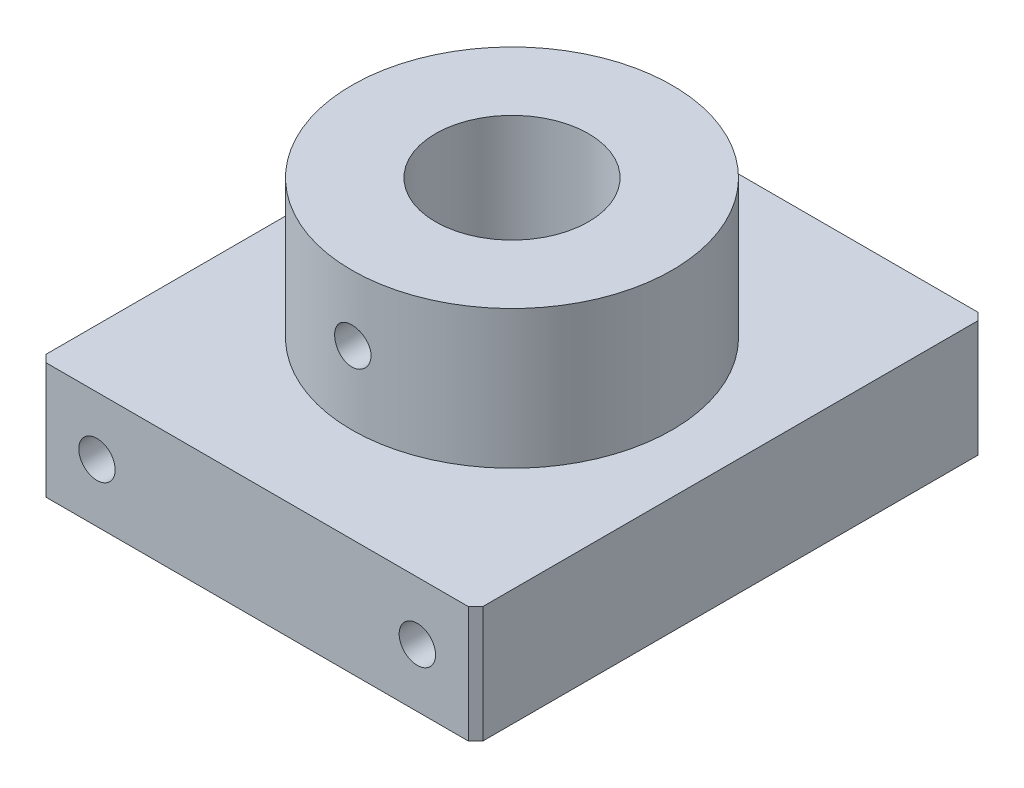
ISO-10303-21;
HEADER;
FILE_DESCRIPTION(('STEP AP214'),'2;1');
FILE_NAME('part.step','',(''),(''),'','','');
FILE_SCHEMA(('AUTOMOTIVE_DESIGN { 1 0 10303 214 1 1 1 1 }'));
ENDSEC;
DATA;
#1=APPLICATION_CONTEXT('core data for automotive mechanical design processes');
#2=APPLICATION_PROTOCOL_DEFINITION('international standard','automotive_design',2000,#1);
#3=PRODUCT_CONTEXT('',#1,'mechanical');
#4=PRODUCT('Part','Part','',(#3));
#5=PRODUCT_RELATED_PRODUCT_CATEGORY('part','',(#4));
#6=PRODUCT_DEFINITION_FORMATION('','',#4);
#7=PRODUCT_DEFINITION_CONTEXT('part definition',#1,'design');
#8=PRODUCT_DEFINITION('design','',#6,#7);
#9=PRODUCT_DEFINITION_SHAPE('','',#8);
#10=(LENGTH_UNIT() NAMED_UNIT(*) SI_UNIT(.MILLI.,.METRE.));
#11=(NAMED_UNIT(*) PLANE_ANGLE_UNIT() SI_UNIT($,.RADIAN.));
#12=(NAMED_UNIT(*) SI_UNIT($,.STERADIAN.) SOLID_ANGLE_UNIT());
#13=UNCERTAINTY_MEASURE_WITH_UNIT(LENGTH_MEASURE(1.E-05),#10,'distance_accuracy_value','');
#14=(GEOMETRIC_REPRESENTATION_CONTEXT(3) GLOBAL_UNCERTAINTY_ASSIGNED_CONTEXT((#13)) GLOBAL_UNIT_ASSIGNED_CONTEXT((#10,
#11,#12)) REPRESENTATION_CONTEXT('',''));
#15=CARTESIAN_POINT('',(0.,0.,0.));
#16=DIRECTION('',(0.,0.,1.));
#17=DIRECTION('',(1.,0.,0.));
#18=AXIS2_PLACEMENT_3D('',#15,#16,#17);
#19=CARTESIAN_POINT('',(0.,18.5,0.));
#20=DIRECTION('',(0.,-1.,0.));
#21=DIRECTION('',(0.,0.,-1.));
#22=AXIS2_PLACEMENT_3D('',#19,#20,#21);
#23=CYLINDRICAL_SURFACE('',#22,5.25);
#24=CARTESIAN_POINT('',(0.,1.,0.));
#25=DIRECTION('',(0.,-1.,0.));
#26=DIRECTION('',(0.,0.,-1.));
#27=AXIS2_PLACEMENT_3D('',#24,#25,#26);
#28=CIRCLE('',#27,5.25);
#29=CARTESIAN_POINT('',(0.,1.,-5.25));
#30=VERTEX_POINT('',#29);
#31=EDGE_CURVE('E193',#30,#30,#28,.T.);
#32=ORIENTED_EDGE('',*,*,#31,.T.);
#33=EDGE_LOOP('',(#32));
#34=FACE_BOUND('',#33,.T.);
#35=CARTESIAN_POINT('',(0.,18.5,0.));
#36=DIRECTION('',(0.,1.,0.));
#37=DIRECTION('',(0.,0.,1.));
#38=AXIS2_PLACEMENT_3D('',#35,#36,#37);
#39=CIRCLE('',#38,5.25);
#40=CARTESIAN_POINT('',(0.,18.5,5.25));
#41=VERTEX_POINT('',#40);
#42=EDGE_CURVE('E196',#41,#41,#39,.T.);
#43=ORIENTED_EDGE('',*,*,#42,.T.);
#44=EDGE_LOOP('',(#43));
#45=FACE_BOUND('',#44,.T.);
#46=CARTESIAN_POINT('',(-1.25,14.,5.09901951359278));
#47=CARTESIAN_POINT('',(-1.24999785885749,13.9308632633188,5.09902088312665));
#48=CARTESIAN_POINT('',(-1.24424460502482,13.8617020633044,5.10044097404398));
#49=CARTESIAN_POINT('',(-1.22141569373254,13.7253581132359,5.10595502478239));
#50=CARTESIAN_POINT('',(-1.20433282053128,13.6581766525598,5.11005068862898));
#51=CARTESIAN_POINT('',(-1.15942266716622,13.5277840352296,5.12042632881042));
#52=CARTESIAN_POINT('',(-1.13160842896906,13.4645681671408,5.12670365283029));
#53=CARTESIAN_POINT('',(-1.06606393450019,13.3436952080516,5.14073206322753));
#54=CARTESIAN_POINT('',(-1.02833350066957,13.2860382166133,5.1484831759938));
#55=CARTESIAN_POINT('',(-0.943223109329421,13.1767675717083,5.16475903740231));
#56=CARTESIAN_POINT('',(-0.895681783952359,13.1252812823599,5.17329519422943));
#57=CARTESIAN_POINT('',(-0.7926470344949,13.03093299232,5.19008001857373));
#58=CARTESIAN_POINT('',(-0.737152919242241,12.9880717420047,5.19832866102566));
#59=CARTESIAN_POINT('',(-0.618922605539103,12.9116759128867,5.21373451513865));
#60=CARTESIAN_POINT('',(-0.556104094770733,12.8782654274744,5.22087669359737));
#61=CARTESIAN_POINT('',(-0.425544703519859,12.8225247871224,5.23313524630461));
#62=CARTESIAN_POINT('',(-0.357804481332189,12.8001931534667,5.23825189088664));
#63=CARTESIAN_POINT('',(-0.220651076167158,12.7676491846949,5.24580223262853));
#64=CARTESIAN_POINT('',(-0.151291823574652,12.7572208358709,5.24828369162804));
#65=CARTESIAN_POINT('',(-0.0117669026683114,12.7481024611951,5.25045012977004));
#66=CARTESIAN_POINT('',(0.0583986558104548,12.7494108550572,5.25013548539208));
#67=CARTESIAN_POINT('',(0.196049861550263,12.7635712764257,5.24678109833222));
#68=CARTESIAN_POINT('',(0.263561021569537,12.7761902743083,5.24379636914813));
#69=CARTESIAN_POINT('',(0.395478761044506,12.8122404098689,5.23550067625341));
#70=CARTESIAN_POINT('',(0.459885184145752,12.8356720914463,5.23018959552336));
#71=CARTESIAN_POINT('',(0.58439210706731,12.8928778701059,5.21775208111387));
#72=CARTESIAN_POINT('',(0.644451986255142,12.9267370171906,5.21061080322669));
#73=CARTESIAN_POINT('',(0.758120393347283,13.0037725333295,5.19529092235459));
#74=CARTESIAN_POINT('',(0.811727891330253,13.0469503867603,5.18711215419351));
#75=CARTESIAN_POINT('',(0.912358316897834,13.1426547508987,5.1703744370168));
#76=CARTESIAN_POINT('',(0.959186878562015,13.1953850654874,5.16181108488179));
#77=CARTESIAN_POINT('',(1.04337725172812,13.3080398765624,5.1454551339672));
#78=CARTESIAN_POINT('',(1.0807387009173,13.3679646482562,5.13766256469295));
#79=CARTESIAN_POINT('',(1.1450433694534,13.4936618424427,5.12371620404311));
#80=CARTESIAN_POINT('',(1.17194381298967,13.5594569495785,5.11756917263966));
#81=CARTESIAN_POINT('',(1.21424387111502,13.6948163329986,5.10769895823854));
#82=CARTESIAN_POINT('',(1.22964569002254,13.7643798841177,5.10397531068897));
#83=CARTESIAN_POINT('',(1.24819719822852,13.9035094222633,5.09946992286998));
#84=CARTESIAN_POINT('',(1.25163253821561,13.9730351453882,5.09861960859702));
#85=CARTESIAN_POINT('',(1.24693218895611,14.111666119413,5.09977116273299));
#86=CARTESIAN_POINT('',(1.23879745592382,14.1807714045861,5.1017727954414));
#87=CARTESIAN_POINT('',(1.21143734261676,14.3155655779067,5.10833736996044));
#88=CARTESIAN_POINT('',(1.19237468740762,14.3812894993854,5.11286270561253));
#89=CARTESIAN_POINT('',(1.14387857869203,14.5086097516149,5.1239297940766));
#90=CARTESIAN_POINT('',(1.11444398675802,14.5702056283862,5.13047176822569));
#91=CARTESIAN_POINT('',(1.04542931678654,14.6887418733766,5.14498187339137));
#92=CARTESIAN_POINT('',(1.00567640317637,14.7455786716813,5.15297352334474));
#93=CARTESIAN_POINT('',(0.917375042921349,14.8518796645686,5.16942315260144));
#94=CARTESIAN_POINT('',(0.868825291163954,14.9013427631902,5.17788120097065));
#95=CARTESIAN_POINT('',(0.763004603880885,14.9926301907715,5.19454051999405));
#96=CARTESIAN_POINT('',(0.70556229788557,15.0342580258264,5.20273175833321));
#97=CARTESIAN_POINT('',(0.584335590875847,15.1072749383539,5.21773672625508));
#98=CARTESIAN_POINT('',(0.520551510554953,15.1386645332149,5.22455052543991));
#99=CARTESIAN_POINT('',(0.388879861048127,15.1900550380375,5.23599127964168));
#100=CARTESIAN_POINT('',(0.321024383181235,15.2101346594755,5.24063330969237));
#101=CARTESIAN_POINT('',(0.182778339218192,15.2385757802419,5.24727319347292));
#102=CARTESIAN_POINT('',(0.112388216287991,15.246939317944,5.24927150715531));
#103=CARTESIAN_POINT('',(-0.0270756431727837,15.251605203407,5.25038204287669));
#104=CARTESIAN_POINT('',(-0.0961392356234219,15.2481988143379,5.24956396233935));
#105=CARTESIAN_POINT('',(-0.232679577449819,15.2300824828883,5.24528611702384));
#106=CARTESIAN_POINT('',(-0.300156366191009,15.2153728212249,5.24182641785037));
#107=CARTESIAN_POINT('',(-0.431334040661584,15.1752174549718,5.2326626786926));
#108=CARTESIAN_POINT('',(-0.4950504402877,15.1498199791175,5.22696872846421));
#109=CARTESIAN_POINT('',(-0.617352666012322,15.0890545884779,5.21393924600207));
#110=CARTESIAN_POINT('',(-0.675937899517237,15.0536855240679,5.20660352450859));
#111=CARTESIAN_POINT('',(-0.787711991034075,14.9730683468117,5.19088322365525));
#112=CARTESIAN_POINT('',(-0.840753462950589,14.9276196895111,5.18247909165065));
#113=CARTESIAN_POINT('',(-0.938556010634084,14.8285288798353,5.16566363060175));
#114=CARTESIAN_POINT('',(-0.983315030309055,14.7748846989654,5.15725230028973));
#115=CARTESIAN_POINT('',(-1.06400228282945,14.6598602761981,5.14121809211461));
#116=CARTESIAN_POINT('',(-1.09977263989505,14.5983670042507,5.133610511856));
#117=CARTESIAN_POINT('',(-1.16041397113456,14.4700694672378,5.12024517767835));
#118=CARTESIAN_POINT('',(-1.18529339784417,14.4032693685871,5.11448599013699));
#119=CARTESIAN_POINT('',(-1.2194469497698,14.2804237373054,5.10643579215713));
#120=CARTESIAN_POINT('',(-1.23088059691462,14.2249994148778,5.10367460869863));
#121=CARTESIAN_POINT('',(-1.2461577352511,14.1130554638703,5.0999659721163));
#122=CARTESIAN_POINT('',(-1.250001750899,14.0565359112452,5.09901839366945));
#123=CARTESIAN_POINT('',(-1.25,14.,5.09901951359278));
#124=B_SPLINE_CURVE_WITH_KNOTS('',3,(#46,#47,#48,#49,#50,#51,#52,#53,#54,#55,#56,#57,#58,#59,
#60,#61,#62,#63,#64,#65,#66,#67,#68,#69,#70,#71,#72,#73,#74,#75,#76,#77,#78,#79,#80,#81,#82,#83,
#84,#85,#86,#87,#88,#89,#90,#91,#92,#93,#94,#95,#96,#97,#98,#99,#100,#101,#102,#103,#104,#105,
#106,#107,#108,#109,#110,#111,#112,#113,#114,#115,#116,#117,#118,#119,#120,#121,#122,#123),
.UNSPECIFIED.,.T.,.F.,(4,2,2,2,2,2,2,2,2,2,2,2,2,2,2,2,2,2,2,2,2,2,2,2,2,2,2,2,2,2,2,2,2,2,2,2,
2,2,4),(0.,0.207202765184718,0.414537623001911,0.621621293782821,0.828708672846378,
1.03952115472004,1.25035196930543,1.46383464640931,1.67728882189396,1.88680449583214,
2.09629196009315,2.3015601637919,2.50683869401436,2.71383799549591,2.92087029426315,
3.13299433877608,3.34512650019265,3.55811718660249,3.77106703161133,3.97889736743143,
4.18671052801058,4.39150672184535,4.59632540119045,4.80482526343993,5.01335608441855,
5.22656998737045,5.43977311391038,5.65147352089872,5.86313709150276,6.06960065730555,
6.27605909574466,6.48159571532816,6.68715604093016,6.89724669770577,7.1073894390452,
7.32099917179353,7.53444282516292,7.70389263250661,7.87333073017479),.UNSPECIFIED.);
#125=CARTESIAN_POINT('',(-1.25,14.,5.09901951359278));
#126=VERTEX_POINT('',#125);
#127=EDGE_CURVE('E136',#126,#126,#124,.T.);
#128=ORIENTED_EDGE('',*,*,#127,.T.);
#129=EDGE_LOOP('',(#128));
#130=FACE_BOUND('',#129,.T.);
#131=ADVANCED_FACE('F38',(#34,#45,#130),#23,.F.);
#132=CARTESIAN_POINT('',(0.,18.5,0.));
#133=DIRECTION('',(0.,-1.,0.));
#134=DIRECTION('',(0.,0.,-1.));
#135=AXIS2_PLACEMENT_3D('',#132,#133,#134);
#136=CYLINDRICAL_SURFACE('',#135,11.);
#137=CARTESIAN_POINT('',(0.,9.,0.));
#138=DIRECTION('',(0.,1.,0.));
#139=DIRECTION('',(0.,0.,1.));
#140=AXIS2_PLACEMENT_3D('',#137,#138,#139);
#141=CIRCLE('',#140,11.);
#142=CARTESIAN_POINT('',(0.,9.,11.));
#143=VERTEX_POINT('',#142);
#144=EDGE_CURVE('E154',#143,#143,#141,.T.);
#145=ORIENTED_EDGE('',*,*,#144,.T.);
#146=EDGE_LOOP('',(#145));
#147=FACE_BOUND('',#146,.T.);
#148=CARTESIAN_POINT('',(0.,18.5,0.));
#149=DIRECTION('',(0.,1.,0.));
#150=DIRECTION('',(0.,0.,1.));
#151=AXIS2_PLACEMENT_3D('',#148,#149,#150);
#152=CIRCLE('',#151,11.);
#153=CARTESIAN_POINT('',(0.,18.5,11.));
#154=VERTEX_POINT('',#153);
#155=EDGE_CURVE('E199',#154,#154,#152,.T.);
#156=ORIENTED_EDGE('',*,*,#155,.F.);
#157=EDGE_LOOP('',(#156));
#158=FACE_BOUND('',#157,.T.);
#159=CARTESIAN_POINT('',(-1.25,14.,10.9287464971972));
#160=CARTESIAN_POINT('',(-1.24999699672962,13.9300305842613,10.9287474203412));
#161=CARTESIAN_POINT('',(-1.24410533123419,13.8600162149609,10.9294256968444));
#162=CARTESIAN_POINT('',(-1.22069346279135,13.7219324468276,10.93206480453));
#163=CARTESIAN_POINT('',(-1.20316078861801,13.6538652156636,10.9340270111777));
#164=CARTESIAN_POINT('',(-1.15698736299405,13.5216951523593,10.9390089167987));
#165=CARTESIAN_POINT('',(-1.1283537624876,13.4575897988341,10.9420279348789));
#166=CARTESIAN_POINT('',(-1.06080587174069,13.3351073826262,10.9487824680852));
#167=CARTESIAN_POINT('',(-1.02189347562249,13.2767292672735,10.9525178511687));
#168=CARTESIAN_POINT('',(-0.934698474057974,13.1670740793633,10.960303690773));
#169=CARTESIAN_POINT('',(-0.886377679317094,13.1158274589927,10.9643553896711));
#170=CARTESIAN_POINT('',(-0.781819512439416,13.022152635249,10.972306118699));
#171=CARTESIAN_POINT('',(-0.725581762165872,12.9797248533291,10.9762051415251));
#172=CARTESIAN_POINT('',(-0.606596705986045,12.9047845265636,10.9834237379778));
#173=CARTESIAN_POINT('',(-0.543832098928306,12.8722992834268,10.9867417055687));
#174=CARTESIAN_POINT('',(-0.413694602584146,12.8183409317162,10.9924107489094));
#175=CARTESIAN_POINT('',(-0.346321856038785,12.7968674822175,10.9947618545927));
#176=CARTESIAN_POINT('',(-0.209190502606261,12.7656325459075,10.9982235300395));
#177=CARTESIAN_POINT('',(-0.139443508922393,12.7558206741394,10.9993394351575));
#178=CARTESIAN_POINT('',(0.000715496918049551,12.7480313857927,11.0002231636486));
#179=CARTESIAN_POINT('',(0.0711274871279376,12.7500535800112,10.9999910313565));
#180=CARTESIAN_POINT('',(0.210275315304585,12.7658343925776,10.9982091802183));
#181=CARTESIAN_POINT('',(0.279017386981301,12.7795388281065,10.9966655443008));
#182=CARTESIAN_POINT('',(0.413219512424814,12.8182105448547,10.9924410331793));
#183=CARTESIAN_POINT('',(0.478679513109332,12.8431780081703,10.9897601395885));
#184=CARTESIAN_POINT('',(0.604628539711982,12.9037255252043,10.9835519389979));
#185=CARTESIAN_POINT('',(0.66510607447528,12.9393292811366,10.9800227450904));
#186=CARTESIAN_POINT('',(0.779248064757843,13.0201214985528,10.9725133526563));
#187=CARTESIAN_POINT('',(0.832912261857117,13.0653103234111,10.9685331370339));
#188=CARTESIAN_POINT('',(0.93222211057508,13.1642940143929,10.9605411888319));
#189=CARTESIAN_POINT('',(0.977820745734552,13.2181360607783,10.9565294052378));
#190=CARTESIAN_POINT('',(1.05934036226843,13.3327350215473,10.948948782293));
#191=CARTESIAN_POINT('',(1.09526132200676,13.3934919513897,10.9453799439327));
#192=CARTESIAN_POINT('',(1.15640720127769,13.5202351263802,10.9390891806396));
#193=CARTESIAN_POINT('',(1.1816287706134,13.5862230017786,10.9363675210467));
#194=CARTESIAN_POINT('',(1.2206203979332,13.7215350374498,10.932084617603));
#195=CARTESIAN_POINT('',(1.23439090929003,13.7908590655218,10.9305233278108));
#196=CARTESIAN_POINT('',(1.2500281235163,13.9304615086792,10.9287461489754));
#197=CARTESIAN_POINT('',(1.25196080445255,14.000732442199,10.9285228030647));
#198=CARTESIAN_POINT('',(1.24404119003626,14.1405971142031,10.9294271020208));
#199=CARTESIAN_POINT('',(1.23418910135505,14.2101908645416,10.9305547231954));
#200=CARTESIAN_POINT('',(1.20303499666576,14.3465305482009,10.934027109398));
#201=CARTESIAN_POINT('',(1.18176456634837,14.4132837918333,10.9363685162129));
#202=CARTESIAN_POINT('',(1.1284099513492,14.5422755719963,10.9420019373599));
#203=CARTESIAN_POINT('',(1.09632544978195,14.6045139761633,10.9452939795482));
#204=CARTESIAN_POINT('',(1.0220897612546,14.7230089378336,10.9524757008179));
#205=CARTESIAN_POINT('',(0.979895088421218,14.77923809463,10.9563679349346));
#206=CARTESIAN_POINT('',(0.886698692111572,14.8838396721912,10.9643033061882));
#207=CARTESIAN_POINT('',(0.835696686407699,14.9322118410854,10.9683464481578));
#208=CARTESIAN_POINT('',(0.726046118323418,15.0199560606722,10.9761507988363));
#209=CARTESIAN_POINT('',(0.667362868733043,15.0592849070949,10.9799105987227));
#210=CARTESIAN_POINT('',(0.5441855672317,15.1275279306487,10.9867038511446));
#211=CARTESIAN_POINT('',(0.47969161474572,15.1564422859364,10.9897373161048));
#212=CARTESIAN_POINT('',(0.346870699270184,15.2029633102439,10.9947298091327));
#213=CARTESIAN_POINT('',(0.278552765803391,15.2205954885819,10.9966912595789));
#214=CARTESIAN_POINT('',(0.139902450650682,15.2441347668116,10.9993287265974));
#215=CARTESIAN_POINT('',(0.0695701433691041,15.2500422992079,11.0000047905855));
#216=CARTESIAN_POINT('',(-0.0706893992393563,15.2499574810621,10.9999951843542));
#217=CARTESIAN_POINT('',(-0.140616685015208,15.2440319637665,10.9993171620335));
#218=CARTESIAN_POINT('',(-0.278475148129101,15.2205901239769,10.9966907038408));
#219=CARTESIAN_POINT('',(-0.346406325297355,15.2030738004971,10.9947422678608));
#220=CARTESIAN_POINT('',(-0.478339408461339,15.156967401429,10.9897930802668));
#221=CARTESIAN_POINT('',(-0.542342237518438,15.1283799389049,10.9867925769826));
#222=CARTESIAN_POINT('',(-0.664652243904002,15.0609497123396,10.9800725685956));
#223=CARTESIAN_POINT('',(-0.722959401666084,15.0221069130698,10.9763530610229));
#224=CARTESIAN_POINT('',(-0.832565047844878,14.9350195088565,10.9685858505536));
#225=CARTESIAN_POINT('',(-0.883823854811319,14.886725108806,10.964536478797));
#226=CARTESIAN_POINT('',(-0.977537306945034,14.7822070724043,10.9565797023843));
#227=CARTESIAN_POINT('',(-1.019989851868,14.7259815498839,10.9526723317775));
#228=CARTESIAN_POINT('',(-1.09499873222297,14.6069938254487,10.9454285752331));
#229=CARTESIAN_POINT('',(-1.12752283906711,14.5442112053767,10.9420940638439));
#230=CARTESIAN_POINT('',(-1.18152184496679,14.4140751114031,10.9363956617408));
#231=CARTESIAN_POINT('',(-1.20300897659656,14.3467267919478,10.934030697042));
#232=CARTESIAN_POINT('',(-1.22907619814518,14.2325113436276,10.9311241409527));
#233=CARTESIAN_POINT('',(-1.23691161329248,14.1863696162629,10.9302368560492));
#234=CARTESIAN_POINT('',(-1.24737450243374,14.0934919481048,10.929047727445));
#235=CARTESIAN_POINT('',(-1.25000200689031,14.0467560107888,10.9287458803201));
#236=CARTESIAN_POINT('',(-1.25,14.,10.9287464971972));
#237=B_SPLINE_CURVE_WITH_KNOTS('',3,(#159,#160,#161,#162,#163,#164,#165,#166,#167,#168,#169,
#170,#171,#172,#173,#174,#175,#176,#177,#178,#179,#180,#181,#182,#183,#184,#185,#186,#187,#188,
#189,#190,#191,#192,#193,#194,#195,#196,#197,#198,#199,#200,#201,#202,#203,#204,#205,#206,#207,
#208,#209,#210,#211,#212,#213,#214,#215,#216,#217,#218,#219,#220,#221,#222,#223,#224,#225,#226,
#227,#228,#229,#230,#231,#232,#233,#234,#235,#236),.UNSPECIFIED.,.T.,.F.,(4,2,2,2,2,2,2,2,2,2,2,
2,2,2,2,2,2,2,2,2,2,2,2,2,2,2,2,2,2,2,2,2,2,2,2,2,2,2,4),(0.,0.209737471020221,
0.419700000972302,0.629527502350871,0.839316364765073,1.04997522707931,1.26064415448742,
1.47188648272738,1.68312227051642,1.89344203717234,2.10375488679387,2.31309756927458,
2.52244363644887,2.73225974107011,2.94208380133525,3.15309333304239,3.36410333649311,
3.57517936278921,3.78624703172038,3.99613723801842,4.20602376349345,4.41533266527082,
4.62464770097443,4.83487973574455,5.04511850857034,5.25634173818707,5.46756135432011,
5.67830169349605,5.88903425863096,6.09857996924774,6.30812569768832,6.51762199823876,
6.72711901844817,6.93775100821768,7.14843317493098,7.35979213527311,7.57091633262042,
7.71107106616897,7.85122497990818),.UNSPECIFIED.);
#238=CARTESIAN_POINT('',(-1.25,14.,10.9287464971972));
#239=VERTEX_POINT('',#238);
#240=EDGE_CURVE('E42',#239,#239,#237,.T.);
#241=ORIENTED_EDGE('',*,*,#240,.F.);
#242=EDGE_LOOP('',(#241));
#243=FACE_BOUND('',#242,.T.);
#244=ADVANCED_FACE('F257',(#147,#158,#243),#136,.T.);
#245=CARTESIAN_POINT('',(15.,10.,-17.5));
#246=DIRECTION('',(-1.,0.,0.));
#247=DIRECTION('',(0.,0.,1.));
#248=AXIS2_PLACEMENT_3D('',#245,#246,#247);
#249=PLANE('',#248);
#250=DIRECTION('',(0.,0.,-1.));
#251=VECTOR('',#250,1.);
#252=CARTESIAN_POINT('',(15.,9.,-17.5));
#253=LINE('',#252,#251);
#254=CARTESIAN_POINT('',(15.,9.,17.));
#255=VERTEX_POINT('',#254);
#256=CARTESIAN_POINT('',(15.,9.,-17.));
#257=VERTEX_POINT('',#256);
#258=EDGE_CURVE('E158',#255,#257,#253,.T.);
#259=ORIENTED_EDGE('',*,*,#258,.F.);
#260=DIRECTION('',(0.,-1.,0.));
#261=VECTOR('',#260,1.);
#262=CARTESIAN_POINT('',(15.,10.,17.));
#263=LINE('',#262,#261);
#264=CARTESIAN_POINT('',(15.,0.999999999999999,17.));
#265=VERTEX_POINT('',#264);
#266=EDGE_CURVE('E65',#255,#265,#263,.T.);
#267=ORIENTED_EDGE('',*,*,#266,.T.);
#268=DIRECTION('',(0.,0.,1.));
#269=VECTOR('',#268,1.);
#270=CARTESIAN_POINT('',(15.,0.999999999999999,-17.5));
#271=LINE('',#270,#269);
#272=CARTESIAN_POINT('',(15.,0.999999999999999,-17.));
#273=VERTEX_POINT('',#272);
#274=EDGE_CURVE('E176',#273,#265,#271,.T.);
#275=ORIENTED_EDGE('',*,*,#274,.F.);
#276=DIRECTION('',(0.,1.,0.));
#277=VECTOR('',#276,1.);
#278=CARTESIAN_POINT('',(15.,10.,-17.));
#279=LINE('',#278,#277);
#280=EDGE_CURVE('E208',#273,#257,#279,.T.);
#281=ORIENTED_EDGE('',*,*,#280,.T.);
#282=EDGE_LOOP('',(#259,#267,#275,#281));
#283=FACE_BOUND('',#282,.T.);
#284=ADVANCED_FACE('F249',(#283),#249,.F.);
#285=CARTESIAN_POINT('',(-15.,10.,-17.5));
#286=DIRECTION('',(0.,0.,1.));
#287=DIRECTION('',(1.,0.,0.));
#288=AXIS2_PLACEMENT_3D('',#285,#286,#287);
#289=PLANE('',#288);
#290=CARTESIAN_POINT('',(-11.,5.,-17.5));
#291=DIRECTION('',(0.,0.,-1.));
#292=DIRECTION('',(-1.,0.,0.));
#293=AXIS2_PLACEMENT_3D('',#290,#291,#292);
#294=CIRCLE('',#293,1.24999999999999);
#295=CARTESIAN_POINT('',(-12.25,5.,-17.5));
#296=VERTEX_POINT('',#295);
#297=EDGE_CURVE('E130',#296,#296,#294,.T.);
#298=ORIENTED_EDGE('',*,*,#297,.F.);
#299=EDGE_LOOP('',(#298));
#300=FACE_BOUND('',#299,.T.);
#301=CARTESIAN_POINT('',(11.,4.99999999999999,-17.5));
#302=DIRECTION('',(0.,0.,-1.));
#303=DIRECTION('',(-1.,0.,0.));
#304=AXIS2_PLACEMENT_3D('',#301,#302,#303);
#305=CIRCLE('',#304,1.24999999999999);
#306=CARTESIAN_POINT('',(9.75000000000001,4.99999999999999,-17.5));
#307=VERTEX_POINT('',#306);
#308=EDGE_CURVE('E129',#307,#307,#305,.T.);
#309=ORIENTED_EDGE('',*,*,#308,.F.);
#310=EDGE_LOOP('',(#309));
#311=FACE_BOUND('',#310,.T.);
#312=DIRECTION('',(-1.,0.,0.));
#313=VECTOR('',#312,1.);
#314=CARTESIAN_POINT('',(-15.,9.,-17.5));
#315=LINE('',#314,#313);
#316=CARTESIAN_POINT('',(14.5,9.,-17.5));
#317=VERTEX_POINT('',#316);
#318=CARTESIAN_POINT('',(-14.5,9.,-17.5));
#319=VERTEX_POINT('',#318);
#320=EDGE_CURVE('E168',#317,#319,#315,.T.);
#321=ORIENTED_EDGE('',*,*,#320,.F.);
#322=DIRECTION('',(0.,-1.,0.));
#323=VECTOR('',#322,1.);
#324=CARTESIAN_POINT('',(14.5,10.,-17.5));
#325=LINE('',#324,#323);
#326=CARTESIAN_POINT('',(14.5,0.999999999999999,-17.5));
#327=VERTEX_POINT('',#326);
#328=EDGE_CURVE('E205',#317,#327,#325,.T.);
#329=ORIENTED_EDGE('',*,*,#328,.T.);
#330=DIRECTION('',(1.,0.,0.));
#331=VECTOR('',#330,1.);
#332=CARTESIAN_POINT('',(-15.,0.999999999999999,-17.5));
#333=LINE('',#332,#331);
#334=CARTESIAN_POINT('',(-14.5,0.999999999999999,-17.5));
#335=VERTEX_POINT('',#334);
#336=EDGE_CURVE('E187',#335,#327,#333,.T.);
#337=ORIENTED_EDGE('',*,*,#336,.F.);
#338=DIRECTION('',(0.,1.,0.));
#339=VECTOR('',#338,1.);
#340=CARTESIAN_POINT('',(-14.5,10.,-17.5));
#341=LINE('',#340,#339);
#342=EDGE_CURVE('E202',#335,#319,#341,.T.);
#343=ORIENTED_EDGE('',*,*,#342,.T.);
#344=EDGE_LOOP('',(#321,#329,#337,#343));
#345=FACE_BOUND('',#344,.T.);
#346=ADVANCED_FACE('F244',(#300,#311,#345),#289,.F.);
#347=CARTESIAN_POINT('',(-15.,10.,-17.5));
#348=DIRECTION('',(1.,0.,0.));
#349=DIRECTION('',(0.,0.,-1.));
#350=AXIS2_PLACEMENT_3D('',#347,#348,#349);
#351=PLANE('',#350);
#352=DIRECTION('',(0.,0.,1.));
#353=VECTOR('',#352,1.);
#354=CARTESIAN_POINT('',(-15.,9.,-17.5));
#355=LINE('',#354,#353);
#356=CARTESIAN_POINT('',(-15.,9.,-17.));
#357=VERTEX_POINT('',#356);
#358=CARTESIAN_POINT('',(-15.,9.,17.));
#359=VERTEX_POINT('',#358);
#360=EDGE_CURVE('E166',#357,#359,#355,.T.);
#361=ORIENTED_EDGE('',*,*,#360,.F.);
#362=DIRECTION('',(0.,-1.,0.));
#363=VECTOR('',#362,1.);
#364=CARTESIAN_POINT('',(-15.,10.,-17.));
#365=LINE('',#364,#363);
#366=CARTESIAN_POINT('',(-15.,0.999999999999999,-17.));
#367=VERTEX_POINT('',#366);
#368=EDGE_CURVE('E214',#357,#367,#365,.T.);
#369=ORIENTED_EDGE('',*,*,#368,.T.);
#370=DIRECTION('',(0.,0.,-1.));
#371=VECTOR('',#370,1.);
#372=CARTESIAN_POINT('',(-15.,0.999999999999999,-17.5));
#373=LINE('',#372,#371);
#374=CARTESIAN_POINT('',(-15.,0.999999999999999,17.));
#375=VERTEX_POINT('',#374);
#376=EDGE_CURVE('E184',#375,#367,#373,.T.);
#377=ORIENTED_EDGE('',*,*,#376,.F.);
#378=DIRECTION('',(0.,1.,0.));
#379=VECTOR('',#378,1.);
#380=CARTESIAN_POINT('',(-15.,10.,17.));
#381=LINE('',#380,#379);
#382=EDGE_CURVE('E211',#375,#359,#381,.T.);
#383=ORIENTED_EDGE('',*,*,#382,.T.);
#384=EDGE_LOOP('',(#361,#369,#377,#383));
#385=FACE_BOUND('',#384,.T.);
#386=ADVANCED_FACE('F236',(#385),#351,.F.);
#387=CARTESIAN_POINT('',(-15.,10.,17.5));
#388=DIRECTION('',(0.,0.,-1.));
#389=DIRECTION('',(-1.,0.,0.));
#390=AXIS2_PLACEMENT_3D('',#387,#388,#389);
#391=PLANE('',#390);
#392=CARTESIAN_POINT('',(-11.,5.,17.5));
#393=DIRECTION('',(0.,0.,1.));
#394=DIRECTION('',(1.,0.,0.));
#395=AXIS2_PLACEMENT_3D('',#392,#393,#394);
#396=CIRCLE('',#395,1.24999999999999);
#397=CARTESIAN_POINT('',(-9.75,5.,17.5));
#398=VERTEX_POINT('',#397);
#399=EDGE_CURVE('E142',#398,#398,#396,.T.);
#400=ORIENTED_EDGE('',*,*,#399,.F.);
#401=EDGE_LOOP('',(#400));
#402=FACE_BOUND('',#401,.T.);
#403=CARTESIAN_POINT('',(11.,4.99999999999999,17.5));
#404=DIRECTION('',(0.,0.,1.));
#405=DIRECTION('',(1.,0.,0.));
#406=AXIS2_PLACEMENT_3D('',#403,#404,#405);
#407=CIRCLE('',#406,1.24999999999999);
#408=CARTESIAN_POINT('',(12.25,4.99999999999999,17.5));
#409=VERTEX_POINT('',#408);
#410=EDGE_CURVE('E148',#409,#409,#407,.T.);
#411=ORIENTED_EDGE('',*,*,#410,.F.);
#412=EDGE_LOOP('',(#411));
#413=FACE_BOUND('',#412,.T.);
#414=DIRECTION('',(1.,0.,0.));
#415=VECTOR('',#414,1.);
#416=CARTESIAN_POINT('',(-15.,9.,17.5));
#417=LINE('',#416,#415);
#418=CARTESIAN_POINT('',(-14.5,9.,17.5));
#419=VERTEX_POINT('',#418);
#420=CARTESIAN_POINT('',(14.5,9.,17.5));
#421=VERTEX_POINT('',#420);
#422=EDGE_CURVE('E58',#419,#421,#417,.T.);
#423=ORIENTED_EDGE('',*,*,#422,.F.);
#424=DIRECTION('',(0.,-1.,0.));
#425=VECTOR('',#424,1.);
#426=CARTESIAN_POINT('',(-14.5,10.,17.5));
#427=LINE('',#426,#425);
#428=CARTESIAN_POINT('',(-14.5,0.999999999999999,17.5));
#429=VERTEX_POINT('',#428);
#430=EDGE_CURVE('E219',#419,#429,#427,.T.);
#431=ORIENTED_EDGE('',*,*,#430,.T.);
#432=DIRECTION('',(-1.,0.,0.));
#433=VECTOR('',#432,1.);
#434=CARTESIAN_POINT('',(-15.,0.999999999999999,17.5));
#435=LINE('',#434,#433);
#436=CARTESIAN_POINT('',(14.5,0.999999999999999,17.5));
#437=VERTEX_POINT('',#436);
#438=EDGE_CURVE('E173',#437,#429,#435,.T.);
#439=ORIENTED_EDGE('',*,*,#438,.F.);
#440=DIRECTION('',(0.,1.,0.));
#441=VECTOR('',#440,1.);
#442=CARTESIAN_POINT('',(14.5,10.,17.5));
#443=LINE('',#442,#441);
#444=EDGE_CURVE('E216',#437,#421,#443,.T.);
#445=ORIENTED_EDGE('',*,*,#444,.T.);
#446=EDGE_LOOP('',(#423,#431,#439,#445));
#447=FACE_BOUND('',#446,.T.);
#448=ADVANCED_FACE('F228',(#402,#413,#447),#391,.F.);
#449=CARTESIAN_POINT('',(14.5,10.,-17.5));
#450=DIRECTION('',(-0.707106781186552,0.,0.707106781186542));
#451=DIRECTION('',(0.,-1.,0.));
#452=AXIS2_PLACEMENT_3D('',#449,#450,#451);
#453=PLANE('',#452);
#454=ORIENTED_EDGE('',*,*,#328,.F.);
#455=DIRECTION('',(-0.707106781186543,0.,-0.707106781186552));
#456=VECTOR('',#455,1.);
#457=CARTESIAN_POINT('',(14.5,9.,-17.5));
#458=LINE('',#457,#456);
#459=EDGE_CURVE('E163',#317,#257,#458,.F.);
#460=ORIENTED_EDGE('',*,*,#459,.T.);
#461=ORIENTED_EDGE('',*,*,#280,.F.);
#462=DIRECTION('',(0.707106781186543,0.,0.707106781186552));
#463=VECTOR('',#462,1.);
#464=CARTESIAN_POINT('',(14.5,0.999999999999999,-17.5));
#465=LINE('',#464,#463);
#466=EDGE_CURVE('E181',#273,#327,#465,.F.);
#467=ORIENTED_EDGE('',*,*,#466,.T.);
#468=EDGE_LOOP('',(#454,#460,#461,#467));
#469=FACE_BOUND('',#468,.T.);
#470=ADVANCED_FACE('F247',(#469),#453,.F.);
#471=CARTESIAN_POINT('',(-15.,10.,-17.));
#472=DIRECTION('',(0.707106781186538,0.,0.707106781186557));
#473=DIRECTION('',(0.,-1.,0.));
#474=AXIS2_PLACEMENT_3D('',#471,#472,#473);
#475=PLANE('',#474);
#476=ORIENTED_EDGE('',*,*,#368,.F.);
#477=DIRECTION('',(-0.707106781186557,0.,0.707106781186538));
#478=VECTOR('',#477,1.);
#479=CARTESIAN_POINT('',(-15.,9.,-17.));
#480=LINE('',#479,#478);
#481=EDGE_CURVE('E170',#357,#319,#480,.F.);
#482=ORIENTED_EDGE('',*,*,#481,.T.);
#483=ORIENTED_EDGE('',*,*,#342,.F.);
#484=DIRECTION('',(0.707106781186557,0.,-0.707106781186538));
#485=VECTOR('',#484,1.);
#486=CARTESIAN_POINT('',(-15.,0.999999999999999,-17.));
#487=LINE('',#486,#485);
#488=EDGE_CURVE('E190',#335,#367,#487,.F.);
#489=ORIENTED_EDGE('',*,*,#488,.T.);
#490=EDGE_LOOP('',(#476,#482,#483,#489));
#491=FACE_BOUND('',#490,.T.);
#492=ADVANCED_FACE('F239',(#491),#475,.F.);
#493=CARTESIAN_POINT('',(-14.5,10.,17.5));
#494=DIRECTION('',(0.707106781186552,0.,-0.707106781186542));
#495=DIRECTION('',(0.,-1.,0.));
#496=AXIS2_PLACEMENT_3D('',#493,#494,#495);
#497=PLANE('',#496);
#498=ORIENTED_EDGE('',*,*,#430,.F.);
#499=DIRECTION('',(0.707106781186543,0.,0.707106781186552));
#500=VECTOR('',#499,1.);
#501=CARTESIAN_POINT('',(-14.5,9.,17.5));
#502=LINE('',#501,#500);
#503=EDGE_CURVE('E160',#419,#359,#502,.F.);
#504=ORIENTED_EDGE('',*,*,#503,.T.);
#505=ORIENTED_EDGE('',*,*,#382,.F.);
#506=DIRECTION('',(-0.707106781186543,0.,-0.707106781186552));
#507=VECTOR('',#506,1.);
#508=CARTESIAN_POINT('',(-14.5,0.999999999999999,17.5));
#509=LINE('',#508,#507);
#510=EDGE_CURVE('E178',#375,#429,#509,.F.);
#511=ORIENTED_EDGE('',*,*,#510,.T.);
#512=EDGE_LOOP('',(#498,#504,#505,#511));
#513=FACE_BOUND('',#512,.T.);
#514=ADVANCED_FACE('F231',(#513),#497,.F.);
#515=CARTESIAN_POINT('',(15.,10.,17.));
#516=DIRECTION('',(-0.707106781186543,0.,-0.707106781186552));
#517=DIRECTION('',(0.,-1.,0.));
#518=AXIS2_PLACEMENT_3D('',#515,#516,#517);
#519=PLANE('',#518);
#520=ORIENTED_EDGE('',*,*,#266,.F.);
#521=DIRECTION('',(0.707106781186552,0.,-0.707106781186543));
#522=VECTOR('',#521,1.);
#523=CARTESIAN_POINT('',(15.,9.,17.));
#524=LINE('',#523,#522);
#525=EDGE_CURVE('E11',#255,#421,#524,.F.);
#526=ORIENTED_EDGE('',*,*,#525,.T.);
#527=ORIENTED_EDGE('',*,*,#444,.F.);
#528=DIRECTION('',(-0.707106781186552,0.,0.707106781186543));
#529=VECTOR('',#528,1.);
#530=CARTESIAN_POINT('',(15.,0.999999999999999,17.));
#531=LINE('',#530,#529);
#532=EDGE_CURVE('E51',#437,#265,#531,.F.);
#533=ORIENTED_EDGE('',*,*,#532,.T.);
#534=EDGE_LOOP('',(#520,#526,#527,#533));
#535=FACE_BOUND('',#534,.T.);
#536=ADVANCED_FACE('F40',(#535),#519,.F.);
#537=CARTESIAN_POINT('',(0.,18.5,0.));
#538=DIRECTION('',(0.,1.,0.));
#539=DIRECTION('',(0.,0.,1.));
#540=AXIS2_PLACEMENT_3D('',#537,#538,#539);
#541=PLANE('',#540);
#542=ORIENTED_EDGE('',*,*,#155,.T.);
#543=EDGE_LOOP('',(#542));
#544=FACE_BOUND('',#543,.T.);
#545=ORIENTED_EDGE('',*,*,#42,.F.);
#546=EDGE_LOOP('',(#545));
#547=FACE_BOUND('',#546,.T.);
#548=ADVANCED_FACE('F304',(#544,#547),#541,.T.);
#549=CARTESIAN_POINT('',(0.,1.,0.));
#550=DIRECTION('',(0.,-1.,0.));
#551=DIRECTION('',(0.,0.,-1.));
#552=AXIS2_PLACEMENT_3D('',#549,#550,#551);
#553=PLANE('',#552);
#554=ORIENTED_EDGE('',*,*,#31,.F.);
#555=EDGE_LOOP('',(#554));
#556=FACE_BOUND('',#555,.T.);
#557=ORIENTED_EDGE('',*,*,#336,.T.);
#558=ORIENTED_EDGE('',*,*,#466,.F.);
#559=ORIENTED_EDGE('',*,*,#274,.T.);
#560=ORIENTED_EDGE('',*,*,#532,.F.);
#561=ORIENTED_EDGE('',*,*,#438,.T.);
#562=ORIENTED_EDGE('',*,*,#510,.F.);
#563=ORIENTED_EDGE('',*,*,#376,.T.);
#564=ORIENTED_EDGE('',*,*,#488,.F.);
#565=EDGE_LOOP('',(#557,#558,#559,#560,#561,#562,#563,#564));
#566=FACE_BOUND('',#565,.T.);
#567=ADVANCED_FACE('F226',(#556,#566),#553,.T.);
#568=CARTESIAN_POINT('',(0.,9.,0.));
#569=DIRECTION('',(0.,1.,0.));
#570=DIRECTION('',(0.,0.,1.));
#571=AXIS2_PLACEMENT_3D('',#568,#569,#570);
#572=PLANE('',#571);
#573=ORIENTED_EDGE('',*,*,#360,.T.);
#574=ORIENTED_EDGE('',*,*,#503,.F.);
#575=ORIENTED_EDGE('',*,*,#422,.T.);
#576=ORIENTED_EDGE('',*,*,#525,.F.);
#577=ORIENTED_EDGE('',*,*,#258,.T.);
#578=ORIENTED_EDGE('',*,*,#459,.F.);
#579=ORIENTED_EDGE('',*,*,#320,.T.);
#580=ORIENTED_EDGE('',*,*,#481,.F.);
#581=EDGE_LOOP('',(#573,#574,#575,#576,#577,#578,#579,#580));
#582=FACE_BOUND('',#581,.T.);
#583=ORIENTED_EDGE('',*,*,#144,.F.);
#584=EDGE_LOOP('',(#583));
#585=FACE_BOUND('',#584,.T.);
#586=ADVANCED_FACE('F250',(#582,#585),#572,.T.);
#587=CARTESIAN_POINT('',(11.,4.99999999999999,9.50000000000001));
#588=DIRECTION('',(0.,0.,1.));
#589=DIRECTION('',(1.,0.,0.));
#590=AXIS2_PLACEMENT_3D('',#587,#588,#589);
#591=CONICAL_SURFACE('',#590,1.25,1.02974425867665);
#592=CARTESIAN_POINT('',(11.,4.99999999999999,8.74892422621555));
#593=VERTEX_POINT('',#592);
#594=VERTEX_LOOP('',#593);
#595=FACE_BOUND('',#594,.T.);
#596=CARTESIAN_POINT('',(11.,4.99999999999999,9.50000000000001));
#597=DIRECTION('',(0.,0.,1.));
#598=DIRECTION('',(1.,0.,0.));
#599=AXIS2_PLACEMENT_3D('',#596,#597,#598);
#600=CIRCLE('',#599,1.25);
#601=CARTESIAN_POINT('',(12.25,4.99999999999999,9.50000000000001));
#602=VERTEX_POINT('',#601);
#603=EDGE_CURVE('E151',#602,#602,#600,.T.);
#604=ORIENTED_EDGE('',*,*,#603,.T.);
#605=EDGE_LOOP('',(#604));
#606=FACE_BOUND('',#605,.T.);
#607=ADVANCED_FACE('F253',(#595,#606),#591,.F.);
#608=CARTESIAN_POINT('',(11.,4.99999999999999,17.5));
#609=DIRECTION('',(0.,0.,1.));
#610=DIRECTION('',(1.,0.,0.));
#611=AXIS2_PLACEMENT_3D('',#608,#609,#610);
#612=CYLINDRICAL_SURFACE('',#611,1.24999999999999);
#613=ORIENTED_EDGE('',*,*,#603,.F.);
#614=EDGE_LOOP('',(#613));
#615=FACE_BOUND('',#614,.T.);
#616=ORIENTED_EDGE('',*,*,#410,.T.);
#617=EDGE_LOOP('',(#616));
#618=FACE_BOUND('',#617,.T.);
#619=ADVANCED_FACE('F296',(#615,#618),#612,.F.);
#620=CARTESIAN_POINT('',(-11.,5.,9.50000000000001));
#621=DIRECTION('',(0.,0.,1.));
#622=DIRECTION('',(1.,0.,0.));
#623=AXIS2_PLACEMENT_3D('',#620,#621,#622);
#624=CONICAL_SURFACE('',#623,1.25,1.02974425867665);
#625=CARTESIAN_POINT('',(-11.,5.,8.74892422621555));
#626=VERTEX_POINT('',#625);
#627=VERTEX_LOOP('',#626);
#628=FACE_BOUND('',#627,.T.);
#629=CARTESIAN_POINT('',(-11.,5.,9.50000000000001));
#630=DIRECTION('',(0.,0.,1.));
#631=DIRECTION('',(1.,0.,0.));
#632=AXIS2_PLACEMENT_3D('',#629,#630,#631);
#633=CIRCLE('',#632,1.25);
#634=CARTESIAN_POINT('',(-9.74999999999999,5.,9.50000000000001));
#635=VERTEX_POINT('',#634);
#636=EDGE_CURVE('E145',#635,#635,#633,.T.);
#637=ORIENTED_EDGE('',*,*,#636,.T.);
#638=EDGE_LOOP('',(#637));
#639=FACE_BOUND('',#638,.T.);
#640=ADVANCED_FACE('F292',(#628,#639),#624,.F.);
#641=CARTESIAN_POINT('',(-11.,5.,17.5));
#642=DIRECTION('',(0.,0.,1.));
#643=DIRECTION('',(1.,0.,0.));
#644=AXIS2_PLACEMENT_3D('',#641,#642,#643);
#645=CYLINDRICAL_SURFACE('',#644,1.24999999999999);
#646=ORIENTED_EDGE('',*,*,#636,.F.);
#647=EDGE_LOOP('',(#646));
#648=FACE_BOUND('',#647,.T.);
#649=ORIENTED_EDGE('',*,*,#399,.T.);
#650=EDGE_LOOP('',(#649));
#651=FACE_BOUND('',#650,.T.);
#652=ADVANCED_FACE('F288',(#648,#651),#645,.F.);
#653=CARTESIAN_POINT('',(11.,4.99999999999999,-9.50000000000001));
#654=DIRECTION('',(0.,0.,-1.));
#655=DIRECTION('',(-1.,0.,0.));
#656=AXIS2_PLACEMENT_3D('',#653,#654,#655);
#657=CONICAL_SURFACE('',#656,1.25,1.02974425867665);
#658=CARTESIAN_POINT('',(11.,4.99999999999999,-8.74892422621555));
#659=VERTEX_POINT('',#658);
#660=VERTEX_LOOP('',#659);
#661=FACE_BOUND('',#660,.T.);
#662=CARTESIAN_POINT('',(11.,4.99999999999999,-9.50000000000001));
#663=DIRECTION('',(0.,0.,-1.));
#664=DIRECTION('',(-1.,0.,0.));
#665=AXIS2_PLACEMENT_3D('',#662,#663,#664);
#666=CIRCLE('',#665,1.25);
#667=CARTESIAN_POINT('',(9.75,4.99999999999999,-9.50000000000001));
#668=VERTEX_POINT('',#667);
#669=EDGE_CURVE('E133',#668,#668,#666,.T.);
#670=ORIENTED_EDGE('',*,*,#669,.T.);
#671=EDGE_LOOP('',(#670));
#672=FACE_BOUND('',#671,.T.);
#673=ADVANCED_FACE('F284',(#661,#672),#657,.F.);
#674=CARTESIAN_POINT('',(11.,4.99999999999999,-17.5));
#675=DIRECTION('',(0.,0.,-1.));
#676=DIRECTION('',(-1.,0.,0.));
#677=AXIS2_PLACEMENT_3D('',#674,#675,#676);
#678=CYLINDRICAL_SURFACE('',#677,1.24999999999999);
#679=ORIENTED_EDGE('',*,*,#669,.F.);
#680=EDGE_LOOP('',(#679));
#681=FACE_BOUND('',#680,.T.);
#682=ORIENTED_EDGE('',*,*,#308,.T.);
#683=EDGE_LOOP('',(#682));
#684=FACE_BOUND('',#683,.T.);
#685=ADVANCED_FACE('F123',(#681,#684),#678,.F.);
#686=CARTESIAN_POINT('',(-11.,5.,-9.50000000000001));
#687=DIRECTION('',(0.,0.,-1.));
#688=DIRECTION('',(-1.,0.,0.));
#689=AXIS2_PLACEMENT_3D('',#686,#687,#688);
#690=CONICAL_SURFACE('',#689,1.25,1.02974425867665);
#691=CARTESIAN_POINT('',(-11.,5.,-8.74892422621555));
#692=VERTEX_POINT('',#691);
#693=VERTEX_LOOP('',#692);
#694=FACE_BOUND('',#693,.T.);
#695=CARTESIAN_POINT('',(-11.,5.,-9.50000000000001));
#696=DIRECTION('',(0.,0.,-1.));
#697=DIRECTION('',(-1.,0.,0.));
#698=AXIS2_PLACEMENT_3D('',#695,#696,#697);
#699=CIRCLE('',#698,1.25);
#700=CARTESIAN_POINT('',(-12.25,5.,-9.50000000000001));
#701=VERTEX_POINT('',#700);
#702=EDGE_CURVE('E127',#701,#701,#699,.T.);
#703=ORIENTED_EDGE('',*,*,#702,.T.);
#704=EDGE_LOOP('',(#703));
#705=FACE_BOUND('',#704,.T.);
#706=ADVANCED_FACE('F119',(#694,#705),#690,.F.);
#707=CARTESIAN_POINT('',(-11.,5.,-17.5));
#708=DIRECTION('',(0.,0.,-1.));
#709=DIRECTION('',(-1.,0.,0.));
#710=AXIS2_PLACEMENT_3D('',#707,#708,#709);
#711=CYLINDRICAL_SURFACE('',#710,1.24999999999999);
#712=ORIENTED_EDGE('',*,*,#702,.F.);
#713=EDGE_LOOP('',(#712));
#714=FACE_BOUND('',#713,.T.);
#715=ORIENTED_EDGE('',*,*,#297,.T.);
#716=EDGE_LOOP('',(#715));
#717=FACE_BOUND('',#716,.T.);
#718=ADVANCED_FACE('F122',(#714,#717),#711,.F.);
#719=CARTESIAN_POINT('',(0.,14.,17.5));
#720=DIRECTION('',(0.,0.,-1.));
#721=DIRECTION('',(-1.,0.,0.));
#722=AXIS2_PLACEMENT_3D('',#719,#720,#721);
#723=CYLINDRICAL_SURFACE('',#722,1.25);
#724=ORIENTED_EDGE('',*,*,#127,.F.);
#725=EDGE_LOOP('',(#724));
#726=FACE_BOUND('',#725,.T.);
#727=ORIENTED_EDGE('',*,*,#240,.T.);
#728=EDGE_LOOP('',(#727));
#729=FACE_BOUND('',#728,.T.);
#730=ADVANCED_FACE('F274',(#726,#729),#723,.F.);
#731=CLOSED_SHELL('',(#131,#244,#284,#346,#386,#448,#470,#492,#514,#536,#548,#567,#586,#607,
#619,#640,#652,#673,#685,#706,#718,#730));
#732=MANIFOLD_SOLID_BREP('B2',#731);
#733=ADVANCED_BREP_SHAPE_REPRESENTATION('',(#18,#732),#14);
#734=SHAPE_DEFINITION_REPRESENTATION(#9,#733);
ENDSEC;
END-ISO-10303-21;
